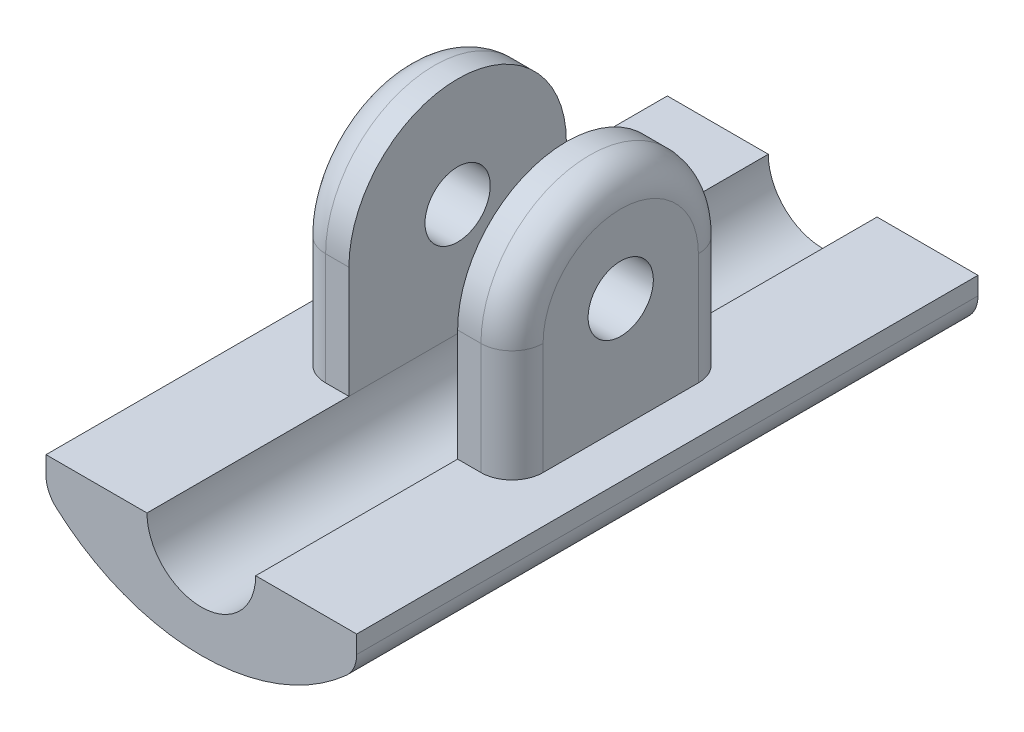
ISO-10303-21;
HEADER;
FILE_DESCRIPTION(('STEP AP214'),'2;1');
FILE_NAME('part.step','',(''),(''),'','','');
FILE_SCHEMA(('AUTOMOTIVE_DESIGN { 1 0 10303 214 1 1 1 1 }'));
ENDSEC;
DATA;
#1=APPLICATION_CONTEXT('core data for automotive mechanical design processes');
#2=APPLICATION_PROTOCOL_DEFINITION('international standard','automotive_design',2000,#1);
#3=PRODUCT_CONTEXT('',#1,'mechanical');
#4=PRODUCT('Part','Part','',(#3));
#5=PRODUCT_RELATED_PRODUCT_CATEGORY('part','',(#4));
#6=PRODUCT_DEFINITION_FORMATION('','',#4);
#7=PRODUCT_DEFINITION_CONTEXT('part definition',#1,'design');
#8=PRODUCT_DEFINITION('design','',#6,#7);
#9=PRODUCT_DEFINITION_SHAPE('','',#8);
#10=(LENGTH_UNIT() NAMED_UNIT(*) SI_UNIT(.MILLI.,.METRE.));
#11=(NAMED_UNIT(*) PLANE_ANGLE_UNIT() SI_UNIT($,.RADIAN.));
#12=(NAMED_UNIT(*) SI_UNIT($,.STERADIAN.) SOLID_ANGLE_UNIT());
#13=UNCERTAINTY_MEASURE_WITH_UNIT(LENGTH_MEASURE(1.E-05),#10,'distance_accuracy_value','');
#14=(GEOMETRIC_REPRESENTATION_CONTEXT(3) GLOBAL_UNCERTAINTY_ASSIGNED_CONTEXT((#13)) GLOBAL_UNIT_ASSIGNED_CONTEXT((#10,
#11,#12)) REPRESENTATION_CONTEXT('',''));
#15=CARTESIAN_POINT('',(0.,0.,0.));
#16=DIRECTION('',(0.,0.,1.));
#17=DIRECTION('',(1.,0.,0.));
#18=AXIS2_PLACEMENT_3D('',#15,#16,#17);
#19=CARTESIAN_POINT('',(0.,2.,-20.));
#20=DIRECTION('',(0.,-1.,0.));
#21=DIRECTION('',(1.,0.,0.));
#22=AXIS2_PLACEMENT_3D('',#19,#20,#21);
#23=PLANE('',#22);
#24=DIRECTION('',(1.,0.,0.));
#25=VECTOR('',#24,1.);
#26=CARTESIAN_POINT('',(0.,2.,-20.));
#27=LINE('',#26,#25);
#28=CARTESIAN_POINT('',(3.5,2.,-20.));
#29=VERTEX_POINT('',#28);
#30=CARTESIAN_POINT('',(10.,2.,-20.));
#31=VERTEX_POINT('',#30);
#32=EDGE_CURVE('E217',#29,#31,#27,.T.);
#33=ORIENTED_EDGE('',*,*,#32,.F.);
#34=DIRECTION('',(0.,0.,1.));
#35=VECTOR('',#34,1.);
#36=CARTESIAN_POINT('',(3.5,2.,-40.));
#37=LINE('',#36,#35);
#38=CARTESIAN_POINT('',(3.5,2.,-7.));
#39=VERTEX_POINT('',#38);
#40=EDGE_CURVE('E198',#29,#39,#37,.T.);
#41=ORIENTED_EDGE('',*,*,#40,.T.);
#42=DIRECTION('',(1.,0.,0.));
#43=VECTOR('',#42,1.);
#44=CARTESIAN_POINT('',(-7.,2.,-7.));
#45=LINE('',#44,#43);
#46=CARTESIAN_POINT('',(5.,2.,-7.));
#47=VERTEX_POINT('',#46);
#48=EDGE_CURVE('E321',#39,#47,#45,.T.);
#49=ORIENTED_EDGE('',*,*,#48,.T.);
#50=CARTESIAN_POINT('',(5.,2.,-5.));
#51=DIRECTION('',(0.,-1.,0.));
#52=DIRECTION('',(1.,0.,0.));
#53=AXIS2_PLACEMENT_3D('',#50,#51,#52);
#54=CIRCLE('',#53,2.);
#55=CARTESIAN_POINT('',(7.,2.,-5.));
#56=VERTEX_POINT('',#55);
#57=EDGE_CURVE('E47',#47,#56,#54,.T.);
#58=ORIENTED_EDGE('',*,*,#57,.T.);
#59=DIRECTION('',(0.,0.,-1.));
#60=VECTOR('',#59,1.);
#61=CARTESIAN_POINT('',(7.,2.,0.));
#62=LINE('',#61,#60);
#63=CARTESIAN_POINT('',(7.,2.,5.));
#64=VERTEX_POINT('',#63);
#65=EDGE_CURVE('E299',#64,#56,#62,.T.);
#66=ORIENTED_EDGE('',*,*,#65,.F.);
#67=CARTESIAN_POINT('',(5.,2.,5.));
#68=DIRECTION('',(0.,-1.,0.));
#69=DIRECTION('',(1.,0.,0.));
#70=AXIS2_PLACEMENT_3D('',#67,#68,#69);
#71=CIRCLE('',#70,2.);
#72=CARTESIAN_POINT('',(5.,2.00000000000001,7.));
#73=VERTEX_POINT('',#72);
#74=EDGE_CURVE('E11',#64,#73,#71,.T.);
#75=ORIENTED_EDGE('',*,*,#74,.T.);
#76=DIRECTION('',(1.,0.,0.));
#77=VECTOR('',#76,1.);
#78=CARTESIAN_POINT('',(-7.,2.00000000000001,7.));
#79=LINE('',#78,#77);
#80=CARTESIAN_POINT('',(3.5,2.00000000000001,7.));
#81=VERTEX_POINT('',#80);
#82=EDGE_CURVE('E195',#81,#73,#79,.T.);
#83=ORIENTED_EDGE('',*,*,#82,.F.);
#84=CARTESIAN_POINT('',(3.5,2.,20.));
#85=VERTEX_POINT('',#84);
#86=EDGE_CURVE('E180',#81,#85,#37,.T.);
#87=ORIENTED_EDGE('',*,*,#86,.T.);
#88=DIRECTION('',(1.,0.,0.));
#89=VECTOR('',#88,1.);
#90=CARTESIAN_POINT('',(0.,2.,20.));
#91=LINE('',#90,#89);
#92=CARTESIAN_POINT('',(10.,2.,20.));
#93=VERTEX_POINT('',#92);
#94=EDGE_CURVE('E193',#85,#93,#91,.T.);
#95=ORIENTED_EDGE('',*,*,#94,.T.);
#96=DIRECTION('',(0.,0.,1.));
#97=VECTOR('',#96,1.);
#98=CARTESIAN_POINT('',(10.,2.,-20.));
#99=LINE('',#98,#97);
#100=EDGE_CURVE('E223',#31,#93,#99,.T.);
#101=ORIENTED_EDGE('',*,*,#100,.F.);
#102=EDGE_LOOP('',(#33,#41,#49,#58,#66,#75,#83,#87,#95,#101));
#103=FACE_BOUND('',#102,.T.);
#104=ADVANCED_FACE('F38',(#103),#23,.F.);
#105=CARTESIAN_POINT('',(-7.,9.2,0.));
#106=DIRECTION('',(1.,0.,0.));
#107=DIRECTION('',(0.,0.,-1.));
#108=AXIS2_PLACEMENT_3D('',#105,#106,#107);
#109=CYLINDRICAL_SURFACE('',#108,7.);
#110=DIRECTION('',(1.,0.,0.));
#111=VECTOR('',#110,1.);
#112=CARTESIAN_POINT('',(-7.,9.2,-7.));
#113=LINE('',#112,#111);
#114=CARTESIAN_POINT('',(-5.,9.2,-7.));
#115=VERTEX_POINT('',#114);
#116=CARTESIAN_POINT('',(-3.5,9.2,-7.));
#117=VERTEX_POINT('',#116);
#118=EDGE_CURVE('E316',#115,#117,#113,.T.);
#119=ORIENTED_EDGE('',*,*,#118,.F.);
#120=CARTESIAN_POINT('',(-5.,9.2,0.));
#121=DIRECTION('',(1.,0.,0.));
#122=DIRECTION('',(0.,0.,-1.));
#123=AXIS2_PLACEMENT_3D('',#120,#121,#122);
#124=CIRCLE('',#123,7.);
#125=CARTESIAN_POINT('',(-5.,9.2,7.));
#126=VERTEX_POINT('',#125);
#127=EDGE_CURVE('E270',#115,#126,#124,.T.);
#128=ORIENTED_EDGE('',*,*,#127,.T.);
#129=DIRECTION('',(1.,0.,0.));
#130=VECTOR('',#129,1.);
#131=CARTESIAN_POINT('',(-7.,9.2,7.));
#132=LINE('',#131,#130);
#133=CARTESIAN_POINT('',(-3.5,9.2,7.));
#134=VERTEX_POINT('',#133);
#135=EDGE_CURVE('E324',#126,#134,#132,.T.);
#136=ORIENTED_EDGE('',*,*,#135,.T.);
#137=CARTESIAN_POINT('',(-3.5,9.2,0.));
#138=DIRECTION('',(-1.,0.,0.));
#139=DIRECTION('',(0.,0.,1.));
#140=AXIS2_PLACEMENT_3D('',#137,#138,#139);
#141=CIRCLE('',#140,7.);
#142=EDGE_CURVE('E309',#117,#134,#141,.F.);
#143=ORIENTED_EDGE('',*,*,#142,.F.);
#144=EDGE_LOOP('',(#119,#128,#136,#143));
#145=FACE_BOUND('',#144,.T.);
#146=ADVANCED_FACE('F372',(#145),#109,.T.);
#147=CARTESIAN_POINT('',(-7.,0.,-7.));
#148=DIRECTION('',(0.,0.,-1.));
#149=DIRECTION('',(0.,1.,0.));
#150=AXIS2_PLACEMENT_3D('',#147,#148,#149);
#151=PLANE('',#150);
#152=CARTESIAN_POINT('',(-5.,2.,-7.));
#153=VERTEX_POINT('',#152);
#154=CARTESIAN_POINT('',(-3.5,2.,-7.));
#155=VERTEX_POINT('',#154);
#156=EDGE_CURVE('E319',#153,#155,#45,.T.);
#157=ORIENTED_EDGE('',*,*,#156,.F.);
#158=DIRECTION('',(0.,1.,0.));
#159=VECTOR('',#158,1.);
#160=CARTESIAN_POINT('',(-5.,9.2,-7.));
#161=LINE('',#160,#159);
#162=EDGE_CURVE('E249',#153,#115,#161,.T.);
#163=ORIENTED_EDGE('',*,*,#162,.T.);
#164=ORIENTED_EDGE('',*,*,#118,.T.);
#165=DIRECTION('',(0.,1.,0.));
#166=VECTOR('',#165,1.);
#167=CARTESIAN_POINT('',(-3.5,0.,-7.));
#168=LINE('',#167,#166);
#169=EDGE_CURVE('E445',#155,#117,#168,.T.);
#170=ORIENTED_EDGE('',*,*,#169,.F.);
#171=EDGE_LOOP('',(#157,#163,#164,#170));
#172=FACE_BOUND('',#171,.T.);
#173=ADVANCED_FACE('F377',(#172),#151,.T.);
#174=CARTESIAN_POINT('',(-7.,9.2,0.));
#175=DIRECTION('',(1.,0.,0.));
#176=DIRECTION('',(0.,0.,-1.));
#177=AXIS2_PLACEMENT_3D('',#174,#175,#176);
#178=CYLINDRICAL_SURFACE('',#177,2.1);
#179=CARTESIAN_POINT('',(-3.5,9.2,0.));
#180=DIRECTION('',(-1.,0.,0.));
#181=DIRECTION('',(0.,0.,1.));
#182=AXIS2_PLACEMENT_3D('',#179,#180,#181);
#183=CIRCLE('',#182,2.1);
#184=CARTESIAN_POINT('',(-3.5,9.2,2.1));
#185=VERTEX_POINT('',#184);
#186=EDGE_CURVE('E442',#185,#185,#183,.F.);
#187=ORIENTED_EDGE('',*,*,#186,.T.);
#188=EDGE_LOOP('',(#187));
#189=FACE_BOUND('',#188,.T.);
#190=CARTESIAN_POINT('',(-7.,9.2,0.));
#191=DIRECTION('',(1.,0.,0.));
#192=DIRECTION('',(0.,0.,-1.));
#193=AXIS2_PLACEMENT_3D('',#190,#191,#192);
#194=CIRCLE('',#193,2.1);
#195=CARTESIAN_POINT('',(-7.,9.2,-2.1));
#196=VERTEX_POINT('',#195);
#197=EDGE_CURVE('E302',#196,#196,#194,.T.);
#198=ORIENTED_EDGE('',*,*,#197,.F.);
#199=EDGE_LOOP('',(#198));
#200=FACE_BOUND('',#199,.T.);
#201=ADVANCED_FACE('F403',(#189,#200),#178,.F.);
#202=CARTESIAN_POINT('',(-7.,0.,7.));
#203=DIRECTION('',(0.,0.,-1.));
#204=DIRECTION('',(-1.,0.,0.));
#205=AXIS2_PLACEMENT_3D('',#202,#203,#204);
#206=PLANE('',#205);
#207=ORIENTED_EDGE('',*,*,#135,.F.);
#208=DIRECTION('',(0.,1.,0.));
#209=VECTOR('',#208,1.);
#210=CARTESIAN_POINT('',(-5.,0.,7.));
#211=LINE('',#210,#209);
#212=CARTESIAN_POINT('',(-5.,2.00000000000001,7.));
#213=VERTEX_POINT('',#212);
#214=EDGE_CURVE('E258',#126,#213,#211,.F.);
#215=ORIENTED_EDGE('',*,*,#214,.T.);
#216=CARTESIAN_POINT('',(-3.5,2.,7.));
#217=VERTEX_POINT('',#216);
#218=EDGE_CURVE('E322',#213,#217,#79,.T.);
#219=ORIENTED_EDGE('',*,*,#218,.T.);
#220=DIRECTION('',(0.,1.,0.));
#221=VECTOR('',#220,1.);
#222=CARTESIAN_POINT('',(-3.5,0.,7.));
#223=LINE('',#222,#221);
#224=EDGE_CURVE('E227',#217,#134,#223,.T.);
#225=ORIENTED_EDGE('',*,*,#224,.T.);
#226=EDGE_LOOP('',(#207,#215,#219,#225));
#227=FACE_BOUND('',#226,.T.);
#228=ADVANCED_FACE('F391',(#227),#206,.F.);
#229=CARTESIAN_POINT('',(0.,9.79795897113272,-20.));
#230=DIRECTION('',(0.,0.,1.));
#231=DIRECTION('',(1.,0.,0.));
#232=AXIS2_PLACEMENT_3D('',#229,#230,#231);
#233=CYLINDRICAL_SURFACE('',#232,14.);
#234=CARTESIAN_POINT('',(0.,9.79795897113272,20.));
#235=DIRECTION('',(0.,0.,1.));
#236=DIRECTION('',(1.,0.,0.));
#237=AXIS2_PLACEMENT_3D('',#234,#235,#236);
#238=CIRCLE('',#237,14.);
#239=CARTESIAN_POINT('',(9.33333333333333,-0.637024923866303,20.));
#240=VERTEX_POINT('',#239);
#241=CARTESIAN_POINT('',(-9.33333333333333,-0.637024923866306,20.));
#242=VERTEX_POINT('',#241);
#243=EDGE_CURVE('E206',#240,#242,#238,.F.);
#244=ORIENTED_EDGE('',*,*,#243,.T.);
#245=DIRECTION('',(0.,0.,1.));
#246=VECTOR('',#245,1.);
#247=CARTESIAN_POINT('',(-9.33333333333333,-0.637024923866306,-20.));
#248=LINE('',#247,#246);
#249=CARTESIAN_POINT('',(-9.33333333333333,-0.637024923866306,-20.));
#250=VERTEX_POINT('',#249);
#251=EDGE_CURVE('E241',#242,#250,#248,.F.);
#252=ORIENTED_EDGE('',*,*,#251,.T.);
#253=CARTESIAN_POINT('',(0.,9.79795897113272,-20.));
#254=DIRECTION('',(0.,0.,1.));
#255=DIRECTION('',(1.,0.,0.));
#256=AXIS2_PLACEMENT_3D('',#253,#254,#255);
#257=CIRCLE('',#256,14.);
#258=CARTESIAN_POINT('',(9.33333333333333,-0.637024923866303,-20.));
#259=VERTEX_POINT('',#258);
#260=EDGE_CURVE('E211',#259,#250,#257,.F.);
#261=ORIENTED_EDGE('',*,*,#260,.F.);
#262=DIRECTION('',(0.,0.,1.));
#263=VECTOR('',#262,1.);
#264=CARTESIAN_POINT('',(9.33333333333333,-0.637024923866305,-20.));
#265=LINE('',#264,#263);
#266=EDGE_CURVE('E238',#259,#240,#265,.T.);
#267=ORIENTED_EDGE('',*,*,#266,.T.);
#268=EDGE_LOOP('',(#244,#252,#261,#267));
#269=FACE_BOUND('',#268,.T.);
#270=ADVANCED_FACE('F329',(#269),#233,.T.);
#271=CARTESIAN_POINT('',(-10.,0.,-20.));
#272=DIRECTION('',(1.,0.,0.));
#273=DIRECTION('',(0.,0.,-1.));
#274=AXIS2_PLACEMENT_3D('',#271,#272,#273);
#275=PLANE('',#274);
#276=DIRECTION('',(0.,1.,0.));
#277=VECTOR('',#276,1.);
#278=CARTESIAN_POINT('',(-10.,0.,-20.));
#279=LINE('',#278,#277);
#280=CARTESIAN_POINT('',(-10.,0.853687061133554,-20.));
#281=VERTEX_POINT('',#280);
#282=CARTESIAN_POINT('',(-10.,2.,-20.));
#283=VERTEX_POINT('',#282);
#284=EDGE_CURVE('E221',#281,#283,#279,.T.);
#285=ORIENTED_EDGE('',*,*,#284,.F.);
#286=DIRECTION('',(0.,0.,1.));
#287=VECTOR('',#286,1.);
#288=CARTESIAN_POINT('',(-10.,0.853687061133554,-20.));
#289=LINE('',#288,#287);
#290=CARTESIAN_POINT('',(-10.,0.853687061133554,20.));
#291=VERTEX_POINT('',#290);
#292=EDGE_CURVE('E231',#281,#291,#289,.T.);
#293=ORIENTED_EDGE('',*,*,#292,.T.);
#294=DIRECTION('',(0.,1.,0.));
#295=VECTOR('',#294,1.);
#296=CARTESIAN_POINT('',(-10.,0.,20.));
#297=LINE('',#296,#295);
#298=CARTESIAN_POINT('',(-10.,2.,20.));
#299=VERTEX_POINT('',#298);
#300=EDGE_CURVE('E205',#291,#299,#297,.T.);
#301=ORIENTED_EDGE('',*,*,#300,.T.);
#302=DIRECTION('',(0.,0.,1.));
#303=VECTOR('',#302,1.);
#304=CARTESIAN_POINT('',(-10.,2.,-20.));
#305=LINE('',#304,#303);
#306=EDGE_CURVE('E224',#283,#299,#305,.T.);
#307=ORIENTED_EDGE('',*,*,#306,.F.);
#308=EDGE_LOOP('',(#285,#293,#301,#307));
#309=FACE_BOUND('',#308,.T.);
#310=ADVANCED_FACE('F341',(#309),#275,.F.);
#311=CARTESIAN_POINT('',(-3.5,2.,20.));
#312=VERTEX_POINT('',#311);
#313=EDGE_CURVE('E203',#299,#312,#91,.T.);
#314=ORIENTED_EDGE('',*,*,#313,.T.);
#315=DIRECTION('',(0.,0.,1.));
#316=VECTOR('',#315,1.);
#317=CARTESIAN_POINT('',(-3.5,2.,-40.));
#318=LINE('',#317,#316);
#319=EDGE_CURVE('E184',#312,#217,#318,.F.);
#320=ORIENTED_EDGE('',*,*,#319,.T.);
#321=ORIENTED_EDGE('',*,*,#218,.F.);
#322=CARTESIAN_POINT('',(-5.,2.,5.));
#323=DIRECTION('',(0.,-1.,0.));
#324=DIRECTION('',(1.,0.,0.));
#325=AXIS2_PLACEMENT_3D('',#322,#323,#324);
#326=CIRCLE('',#325,2.);
#327=CARTESIAN_POINT('',(-7.,2.,5.));
#328=VERTEX_POINT('',#327);
#329=EDGE_CURVE('E276',#213,#328,#326,.T.);
#330=ORIENTED_EDGE('',*,*,#329,.T.);
#331=DIRECTION('',(0.,0.,-1.));
#332=VECTOR('',#331,1.);
#333=CARTESIAN_POINT('',(-7.,2.,0.));
#334=LINE('',#333,#332);
#335=CARTESIAN_POINT('',(-7.,2.,-5.));
#336=VERTEX_POINT('',#335);
#337=EDGE_CURVE('E306',#328,#336,#334,.T.);
#338=ORIENTED_EDGE('',*,*,#337,.T.);
#339=CARTESIAN_POINT('',(-5.,2.,-5.));
#340=DIRECTION('',(0.,-1.,0.));
#341=DIRECTION('',(1.,0.,0.));
#342=AXIS2_PLACEMENT_3D('',#339,#340,#341);
#343=CIRCLE('',#342,2.);
#344=EDGE_CURVE('E274',#336,#153,#343,.T.);
#345=ORIENTED_EDGE('',*,*,#344,.T.);
#346=ORIENTED_EDGE('',*,*,#156,.T.);
#347=CARTESIAN_POINT('',(-3.5,2.,-20.));
#348=VERTEX_POINT('',#347);
#349=EDGE_CURVE('E196',#155,#348,#318,.F.);
#350=ORIENTED_EDGE('',*,*,#349,.T.);
#351=EDGE_CURVE('E218',#283,#348,#27,.T.);
#352=ORIENTED_EDGE('',*,*,#351,.F.);
#353=ORIENTED_EDGE('',*,*,#306,.T.);
#354=EDGE_LOOP('',(#314,#320,#321,#330,#338,#345,#346,#350,#352,#353));
#355=FACE_BOUND('',#354,.T.);
#356=ADVANCED_FACE('F346',(#355),#23,.F.);
#357=CARTESIAN_POINT('',(10.,0.,-20.));
#358=DIRECTION('',(1.,0.,0.));
#359=DIRECTION('',(0.,0.,-1.));
#360=AXIS2_PLACEMENT_3D('',#357,#358,#359);
#361=PLANE('',#360);
#362=DIRECTION('',(0.,1.,0.));
#363=VECTOR('',#362,1.);
#364=CARTESIAN_POINT('',(10.,0.,20.));
#365=LINE('',#364,#363);
#366=CARTESIAN_POINT('',(10.,0.853687061133557,20.));
#367=VERTEX_POINT('',#366);
#368=EDGE_CURVE('E201',#367,#93,#365,.T.);
#369=ORIENTED_EDGE('',*,*,#368,.F.);
#370=DIRECTION('',(0.,0.,-1.));
#371=VECTOR('',#370,1.);
#372=CARTESIAN_POINT('',(10.,0.853687061133557,-20.));
#373=LINE('',#372,#371);
#374=CARTESIAN_POINT('',(10.,0.853687061133557,-20.));
#375=VERTEX_POINT('',#374);
#376=EDGE_CURVE('E247',#367,#375,#373,.T.);
#377=ORIENTED_EDGE('',*,*,#376,.T.);
#378=DIRECTION('',(0.,1.,0.));
#379=VECTOR('',#378,1.);
#380=CARTESIAN_POINT('',(10.,0.,-20.));
#381=LINE('',#380,#379);
#382=EDGE_CURVE('E214',#375,#31,#381,.T.);
#383=ORIENTED_EDGE('',*,*,#382,.T.);
#384=ORIENTED_EDGE('',*,*,#100,.T.);
#385=EDGE_LOOP('',(#369,#377,#383,#384));
#386=FACE_BOUND('',#385,.T.);
#387=ADVANCED_FACE('F355',(#386),#361,.T.);
#388=CARTESIAN_POINT('',(0.,0.,-20.));
#389=DIRECTION('',(0.,0.,1.));
#390=DIRECTION('',(1.,0.,0.));
#391=AXIS2_PLACEMENT_3D('',#388,#389,#390);
#392=PLANE('',#391);
#393=ORIENTED_EDGE('',*,*,#351,.T.);
#394=CARTESIAN_POINT('',(0.,2.,-20.));
#395=DIRECTION('',(0.,0.,1.));
#396=DIRECTION('',(1.,0.,0.));
#397=AXIS2_PLACEMENT_3D('',#394,#395,#396);
#398=CIRCLE('',#397,3.5);
#399=EDGE_CURVE('E349',#348,#29,#398,.T.);
#400=ORIENTED_EDGE('',*,*,#399,.T.);
#401=ORIENTED_EDGE('',*,*,#32,.T.);
#402=ORIENTED_EDGE('',*,*,#382,.F.);
#403=CARTESIAN_POINT('',(8.,0.853687061133557,-20.));
#404=DIRECTION('',(0.,0.,1.));
#405=DIRECTION('',(1.,0.,0.));
#406=AXIS2_PLACEMENT_3D('',#403,#404,#405);
#407=CIRCLE('',#406,2.);
#408=EDGE_CURVE('E243',#375,#259,#407,.F.);
#409=ORIENTED_EDGE('',*,*,#408,.T.);
#410=ORIENTED_EDGE('',*,*,#260,.T.);
#411=CARTESIAN_POINT('',(-8.,0.853687061133554,-20.));
#412=DIRECTION('',(0.,0.,1.));
#413=DIRECTION('',(1.,0.,0.));
#414=AXIS2_PLACEMENT_3D('',#411,#412,#413);
#415=CIRCLE('',#414,2.);
#416=EDGE_CURVE('E245',#250,#281,#415,.F.);
#417=ORIENTED_EDGE('',*,*,#416,.T.);
#418=ORIENTED_EDGE('',*,*,#284,.T.);
#419=EDGE_LOOP('',(#393,#400,#401,#402,#409,#410,#417,#418));
#420=FACE_BOUND('',#419,.T.);
#421=ADVANCED_FACE('F338',(#420),#392,.F.);
#422=CARTESIAN_POINT('',(0.,0.,20.));
#423=DIRECTION('',(0.,0.,1.));
#424=DIRECTION('',(1.,0.,0.));
#425=AXIS2_PLACEMENT_3D('',#422,#423,#424);
#426=PLANE('',#425);
#427=CARTESIAN_POINT('',(0.,2.,20.));
#428=DIRECTION('',(0.,0.,1.));
#429=DIRECTION('',(1.,0.,0.));
#430=AXIS2_PLACEMENT_3D('',#427,#428,#429);
#431=CIRCLE('',#430,3.5);
#432=EDGE_CURVE('E177',#312,#85,#431,.T.);
#433=ORIENTED_EDGE('',*,*,#432,.F.);
#434=ORIENTED_EDGE('',*,*,#313,.F.);
#435=ORIENTED_EDGE('',*,*,#300,.F.);
#436=CARTESIAN_POINT('',(-8.,0.853687061133554,20.));
#437=DIRECTION('',(0.,0.,1.));
#438=DIRECTION('',(1.,0.,0.));
#439=AXIS2_PLACEMENT_3D('',#436,#437,#438);
#440=CIRCLE('',#439,2.);
#441=EDGE_CURVE('E236',#291,#242,#440,.T.);
#442=ORIENTED_EDGE('',*,*,#441,.T.);
#443=ORIENTED_EDGE('',*,*,#243,.F.);
#444=CARTESIAN_POINT('',(8.,0.853687061133557,20.));
#445=DIRECTION('',(0.,0.,1.));
#446=DIRECTION('',(1.,0.,0.));
#447=AXIS2_PLACEMENT_3D('',#444,#445,#446);
#448=CIRCLE('',#447,2.);
#449=EDGE_CURVE('E234',#240,#367,#448,.T.);
#450=ORIENTED_EDGE('',*,*,#449,.T.);
#451=ORIENTED_EDGE('',*,*,#368,.T.);
#452=ORIENTED_EDGE('',*,*,#94,.F.);
#453=EDGE_LOOP('',(#433,#434,#435,#442,#443,#450,#451,#452));
#454=FACE_BOUND('',#453,.T.);
#455=ADVANCED_FACE('F199',(#454),#426,.T.);
#456=CARTESIAN_POINT('',(3.5,9.2,7.));
#457=VERTEX_POINT('',#456);
#458=CARTESIAN_POINT('',(5.,9.2,7.));
#459=VERTEX_POINT('',#458);
#460=EDGE_CURVE('E315',#457,#459,#132,.T.);
#461=ORIENTED_EDGE('',*,*,#460,.T.);
#462=CARTESIAN_POINT('',(5.,9.2,0.));
#463=DIRECTION('',(1.,0.,0.));
#464=DIRECTION('',(0.,0.,-1.));
#465=AXIS2_PLACEMENT_3D('',#462,#463,#464);
#466=CIRCLE('',#465,7.);
#467=CARTESIAN_POINT('',(5.,9.2,-7.));
#468=VERTEX_POINT('',#467);
#469=EDGE_CURVE('E272',#459,#468,#466,.F.);
#470=ORIENTED_EDGE('',*,*,#469,.T.);
#471=CARTESIAN_POINT('',(3.5,9.2,-7.));
#472=VERTEX_POINT('',#471);
#473=EDGE_CURVE('E318',#472,#468,#113,.T.);
#474=ORIENTED_EDGE('',*,*,#473,.F.);
#475=CARTESIAN_POINT('',(3.5,9.2,0.));
#476=DIRECTION('',(1.,0.,0.));
#477=DIRECTION('',(0.,1.,0.));
#478=AXIS2_PLACEMENT_3D('',#475,#476,#477);
#479=CIRCLE('',#478,7.);
#480=EDGE_CURVE('E428',#457,#472,#479,.F.);
#481=ORIENTED_EDGE('',*,*,#480,.F.);
#482=EDGE_LOOP('',(#461,#470,#474,#481));
#483=FACE_BOUND('',#482,.T.);
#484=ADVANCED_FACE('F380',(#483),#109,.T.);
#485=ORIENTED_EDGE('',*,*,#473,.T.);
#486=DIRECTION('',(0.,1.,0.));
#487=VECTOR('',#486,1.);
#488=CARTESIAN_POINT('',(5.,0.,-7.));
#489=LINE('',#488,#487);
#490=EDGE_CURVE('E267',#468,#47,#489,.F.);
#491=ORIENTED_EDGE('',*,*,#490,.T.);
#492=ORIENTED_EDGE('',*,*,#48,.F.);
#493=DIRECTION('',(0.,-1.,0.));
#494=VECTOR('',#493,1.);
#495=CARTESIAN_POINT('',(3.5,0.,-7.));
#496=LINE('',#495,#494);
#497=EDGE_CURVE('E433',#472,#39,#496,.T.);
#498=ORIENTED_EDGE('',*,*,#497,.F.);
#499=EDGE_LOOP('',(#485,#491,#492,#498));
#500=FACE_BOUND('',#499,.T.);
#501=ADVANCED_FACE('F401',(#500),#151,.T.);
#502=CARTESIAN_POINT('',(3.5,9.2,0.));
#503=DIRECTION('',(1.,0.,0.));
#504=DIRECTION('',(0.,1.,0.));
#505=AXIS2_PLACEMENT_3D('',#502,#503,#504);
#506=CIRCLE('',#505,2.1);
#507=CARTESIAN_POINT('',(3.5,11.3,0.));
#508=VERTEX_POINT('',#507);
#509=EDGE_CURVE('E432',#508,#508,#506,.F.);
#510=ORIENTED_EDGE('',*,*,#509,.T.);
#511=EDGE_LOOP('',(#510));
#512=FACE_BOUND('',#511,.T.);
#513=CARTESIAN_POINT('',(7.,9.2,0.));
#514=DIRECTION('',(1.,0.,0.));
#515=DIRECTION('',(0.,0.,-1.));
#516=AXIS2_PLACEMENT_3D('',#513,#514,#515);
#517=CIRCLE('',#516,2.1);
#518=CARTESIAN_POINT('',(7.,9.2,-2.1));
#519=VERTEX_POINT('',#518);
#520=EDGE_CURVE('E303',#519,#519,#517,.T.);
#521=ORIENTED_EDGE('',*,*,#520,.T.);
#522=EDGE_LOOP('',(#521));
#523=FACE_BOUND('',#522,.T.);
#524=ADVANCED_FACE('F398',(#512,#523),#178,.F.);
#525=ORIENTED_EDGE('',*,*,#82,.T.);
#526=DIRECTION('',(0.,1.,0.));
#527=VECTOR('',#526,1.);
#528=CARTESIAN_POINT('',(5.,9.2,7.));
#529=LINE('',#528,#527);
#530=EDGE_CURVE('E60',#73,#459,#529,.T.);
#531=ORIENTED_EDGE('',*,*,#530,.T.);
#532=ORIENTED_EDGE('',*,*,#460,.F.);
#533=DIRECTION('',(0.,1.,0.));
#534=VECTOR('',#533,1.);
#535=CARTESIAN_POINT('',(3.5,2.00000000000001,7.));
#536=LINE('',#535,#534);
#537=EDGE_CURVE('E459',#81,#457,#536,.T.);
#538=ORIENTED_EDGE('',*,*,#537,.F.);
#539=EDGE_LOOP('',(#525,#531,#532,#538));
#540=FACE_BOUND('',#539,.T.);
#541=ADVANCED_FACE('F400',(#540),#206,.F.);
#542=CARTESIAN_POINT('',(-7.,0.,0.));
#543=DIRECTION('',(1.,0.,0.));
#544=DIRECTION('',(0.,0.,-1.));
#545=AXIS2_PLACEMENT_3D('',#542,#543,#544);
#546=PLANE('',#545);
#547=ORIENTED_EDGE('',*,*,#197,.T.);
#548=EDGE_LOOP('',(#547));
#549=FACE_BOUND('',#548,.T.);
#550=CARTESIAN_POINT('',(-7.,9.2,0.));
#551=DIRECTION('',(1.,0.,0.));
#552=DIRECTION('',(0.,0.,-1.));
#553=AXIS2_PLACEMENT_3D('',#550,#551,#552);
#554=CIRCLE('',#553,5.);
#555=CARTESIAN_POINT('',(-7.,9.2,5.));
#556=VERTEX_POINT('',#555);
#557=CARTESIAN_POINT('',(-7.,9.2,-5.));
#558=VERTEX_POINT('',#557);
#559=EDGE_CURVE('E252',#556,#558,#554,.F.);
#560=ORIENTED_EDGE('',*,*,#559,.T.);
#561=DIRECTION('',(0.,1.,0.));
#562=VECTOR('',#561,1.);
#563=CARTESIAN_POINT('',(-7.,2.,-5.));
#564=LINE('',#563,#562);
#565=EDGE_CURVE('E256',#558,#336,#564,.F.);
#566=ORIENTED_EDGE('',*,*,#565,.T.);
#567=ORIENTED_EDGE('',*,*,#337,.F.);
#568=DIRECTION('',(0.,1.,0.));
#569=VECTOR('',#568,1.);
#570=CARTESIAN_POINT('',(-7.,0.,5.));
#571=LINE('',#570,#569);
#572=EDGE_CURVE('E254',#328,#556,#571,.T.);
#573=ORIENTED_EDGE('',*,*,#572,.T.);
#574=EDGE_LOOP('',(#560,#566,#567,#573));
#575=FACE_BOUND('',#574,.T.);
#576=ADVANCED_FACE('F409',(#549,#575),#546,.F.);
#577=CARTESIAN_POINT('',(7.,0.,0.));
#578=DIRECTION('',(1.,0.,0.));
#579=DIRECTION('',(0.,0.,-1.));
#580=AXIS2_PLACEMENT_3D('',#577,#578,#579);
#581=PLANE('',#580);
#582=ORIENTED_EDGE('',*,*,#65,.T.);
#583=DIRECTION('',(0.,1.,0.));
#584=VECTOR('',#583,1.);
#585=CARTESIAN_POINT('',(7.,0.,-5.));
#586=LINE('',#585,#584);
#587=CARTESIAN_POINT('',(7.,9.2,-5.));
#588=VERTEX_POINT('',#587);
#589=EDGE_CURVE('E264',#56,#588,#586,.T.);
#590=ORIENTED_EDGE('',*,*,#589,.T.);
#591=CARTESIAN_POINT('',(7.,9.2,0.));
#592=DIRECTION('',(1.,0.,0.));
#593=DIRECTION('',(0.,0.,-1.));
#594=AXIS2_PLACEMENT_3D('',#591,#592,#593);
#595=CIRCLE('',#594,5.);
#596=CARTESIAN_POINT('',(7.,9.2,5.));
#597=VERTEX_POINT('',#596);
#598=EDGE_CURVE('E260',#588,#597,#595,.T.);
#599=ORIENTED_EDGE('',*,*,#598,.T.);
#600=DIRECTION('',(0.,1.,0.));
#601=VECTOR('',#600,1.);
#602=CARTESIAN_POINT('',(7.,2.00000000000001,5.));
#603=LINE('',#602,#601);
#604=EDGE_CURVE('E262',#597,#64,#603,.F.);
#605=ORIENTED_EDGE('',*,*,#604,.T.);
#606=EDGE_LOOP('',(#582,#590,#599,#605));
#607=FACE_BOUND('',#606,.T.);
#608=ORIENTED_EDGE('',*,*,#520,.F.);
#609=EDGE_LOOP('',(#608));
#610=FACE_BOUND('',#609,.T.);
#611=ADVANCED_FACE('F297',(#607,#610),#581,.T.);
#612=CARTESIAN_POINT('',(-3.5,2.00000000000001,-53.));
#613=DIRECTION('',(-1.,0.,0.));
#614=DIRECTION('',(0.,0.,1.));
#615=AXIS2_PLACEMENT_3D('',#612,#613,#614);
#616=PLANE('',#615);
#617=ORIENTED_EDGE('',*,*,#142,.T.);
#618=ORIENTED_EDGE('',*,*,#224,.F.);
#619=DIRECTION('',(0.,0.,1.));
#620=VECTOR('',#619,1.);
#621=CARTESIAN_POINT('',(-3.5,2.00000000000001,-53.));
#622=LINE('',#621,#620);
#623=EDGE_CURVE('E437',#155,#217,#622,.T.);
#624=ORIENTED_EDGE('',*,*,#623,.F.);
#625=ORIENTED_EDGE('',*,*,#169,.T.);
#626=EDGE_LOOP('',(#617,#618,#624,#625));
#627=FACE_BOUND('',#626,.T.);
#628=ORIENTED_EDGE('',*,*,#186,.F.);
#629=EDGE_LOOP('',(#628));
#630=FACE_BOUND('',#629,.T.);
#631=ADVANCED_FACE('F418',(#627,#630),#616,.F.);
#632=CARTESIAN_POINT('',(3.5,2.00000000000001,-53.));
#633=DIRECTION('',(1.,0.,0.));
#634=DIRECTION('',(0.,1.,0.));
#635=AXIS2_PLACEMENT_3D('',#632,#633,#634);
#636=PLANE('',#635);
#637=ORIENTED_EDGE('',*,*,#480,.T.);
#638=ORIENTED_EDGE('',*,*,#497,.T.);
#639=DIRECTION('',(0.,0.,1.));
#640=VECTOR('',#639,1.);
#641=CARTESIAN_POINT('',(3.5,2.00000000000001,-53.));
#642=LINE('',#641,#640);
#643=EDGE_CURVE('E434',#39,#81,#642,.T.);
#644=ORIENTED_EDGE('',*,*,#643,.T.);
#645=ORIENTED_EDGE('',*,*,#537,.T.);
#646=EDGE_LOOP('',(#637,#638,#644,#645));
#647=FACE_BOUND('',#646,.T.);
#648=ORIENTED_EDGE('',*,*,#509,.F.);
#649=EDGE_LOOP('',(#648));
#650=FACE_BOUND('',#649,.T.);
#651=ADVANCED_FACE('F368',(#647,#650),#636,.F.);
#652=CARTESIAN_POINT('',(-8.,0.853687061133554,-20.));
#653=DIRECTION('',(0.,0.,1.));
#654=DIRECTION('',(1.,0.,0.));
#655=AXIS2_PLACEMENT_3D('',#652,#653,#654);
#656=CYLINDRICAL_SURFACE('',#655,2.);
#657=ORIENTED_EDGE('',*,*,#416,.F.);
#658=ORIENTED_EDGE('',*,*,#251,.F.);
#659=ORIENTED_EDGE('',*,*,#441,.F.);
#660=ORIENTED_EDGE('',*,*,#292,.F.);
#661=EDGE_LOOP('',(#657,#658,#659,#660));
#662=FACE_BOUND('',#661,.T.);
#663=ADVANCED_FACE('F334',(#662),#656,.T.);
#664=CARTESIAN_POINT('',(8.,0.853687061133557,-20.));
#665=DIRECTION('',(0.,0.,1.));
#666=DIRECTION('',(1.,0.,0.));
#667=AXIS2_PLACEMENT_3D('',#664,#665,#666);
#668=CYLINDRICAL_SURFACE('',#667,2.);
#669=ORIENTED_EDGE('',*,*,#408,.F.);
#670=ORIENTED_EDGE('',*,*,#376,.F.);
#671=ORIENTED_EDGE('',*,*,#449,.F.);
#672=ORIENTED_EDGE('',*,*,#266,.F.);
#673=EDGE_LOOP('',(#669,#670,#671,#672));
#674=FACE_BOUND('',#673,.T.);
#675=ADVANCED_FACE('F359',(#674),#668,.T.);
#676=CARTESIAN_POINT('',(0.,2.,-40.));
#677=DIRECTION('',(0.,0.,1.));
#678=DIRECTION('',(1.,0.,0.));
#679=AXIS2_PLACEMENT_3D('',#676,#677,#678);
#680=CYLINDRICAL_SURFACE('',#679,3.5);
#681=ORIENTED_EDGE('',*,*,#432,.T.);
#682=ORIENTED_EDGE('',*,*,#86,.F.);
#683=ORIENTED_EDGE('',*,*,#643,.F.);
#684=ORIENTED_EDGE('',*,*,#40,.F.);
#685=ORIENTED_EDGE('',*,*,#399,.F.);
#686=ORIENTED_EDGE('',*,*,#349,.F.);
#687=ORIENTED_EDGE('',*,*,#623,.T.);
#688=ORIENTED_EDGE('',*,*,#319,.F.);
#689=EDGE_LOOP('',(#681,#682,#683,#684,#685,#686,#687,#688));
#690=FACE_BOUND('',#689,.T.);
#691=ADVANCED_FACE('F179',(#690),#680,.F.);
#692=CARTESIAN_POINT('',(-5.,0.,5.));
#693=DIRECTION('',(0.,1.,0.));
#694=DIRECTION('',(0.,0.,1.));
#695=AXIS2_PLACEMENT_3D('',#692,#693,#694);
#696=CYLINDRICAL_SURFACE('',#695,2.);
#697=ORIENTED_EDGE('',*,*,#329,.F.);
#698=ORIENTED_EDGE('',*,*,#214,.F.);
#699=CARTESIAN_POINT('',(-5.,9.2,5.));
#700=DIRECTION('',(0.,1.,0.));
#701=DIRECTION('',(0.,0.,1.));
#702=AXIS2_PLACEMENT_3D('',#699,#700,#701);
#703=CIRCLE('',#702,2.);
#704=EDGE_CURVE('E189',#556,#126,#703,.T.);
#705=ORIENTED_EDGE('',*,*,#704,.F.);
#706=ORIENTED_EDGE('',*,*,#572,.F.);
#707=EDGE_LOOP('',(#697,#698,#705,#706));
#708=FACE_BOUND('',#707,.T.);
#709=ADVANCED_FACE('F366',(#708),#696,.T.);
#710=CARTESIAN_POINT('',(-5.,9.2,0.));
#711=DIRECTION('',(1.,0.,0.));
#712=DIRECTION('',(0.,0.,-1.));
#713=AXIS2_PLACEMENT_3D('',#710,#711,#712);
#714=TOROIDAL_SURFACE('',#713,5.,2.);
#715=ORIENTED_EDGE('',*,*,#704,.T.);
#716=ORIENTED_EDGE('',*,*,#127,.F.);
#717=CARTESIAN_POINT('',(-5.,9.2,-5.));
#718=DIRECTION('',(0.,-1.,0.));
#719=DIRECTION('',(0.,0.,-1.));
#720=AXIS2_PLACEMENT_3D('',#717,#718,#719);
#721=CIRCLE('',#720,2.);
#722=EDGE_CURVE('E279',#558,#115,#721,.T.);
#723=ORIENTED_EDGE('',*,*,#722,.F.);
#724=ORIENTED_EDGE('',*,*,#559,.F.);
#725=EDGE_LOOP('',(#715,#716,#723,#724));
#726=FACE_BOUND('',#725,.T.);
#727=ADVANCED_FACE('F475',(#726),#714,.T.);
#728=CARTESIAN_POINT('',(-5.,0.,-5.));
#729=DIRECTION('',(0.,-1.,0.));
#730=DIRECTION('',(0.,0.,-1.));
#731=AXIS2_PLACEMENT_3D('',#728,#729,#730);
#732=CYLINDRICAL_SURFACE('',#731,2.);
#733=ORIENTED_EDGE('',*,*,#344,.F.);
#734=ORIENTED_EDGE('',*,*,#565,.F.);
#735=ORIENTED_EDGE('',*,*,#722,.T.);
#736=ORIENTED_EDGE('',*,*,#162,.F.);
#737=EDGE_LOOP('',(#733,#734,#735,#736));
#738=FACE_BOUND('',#737,.T.);
#739=ADVANCED_FACE('F478',(#738),#732,.T.);
#740=CARTESIAN_POINT('',(5.,0.,5.));
#741=DIRECTION('',(0.,-1.,0.));
#742=DIRECTION('',(0.,0.,-1.));
#743=AXIS2_PLACEMENT_3D('',#740,#741,#742);
#744=CYLINDRICAL_SURFACE('',#743,2.);
#745=ORIENTED_EDGE('',*,*,#74,.F.);
#746=ORIENTED_EDGE('',*,*,#604,.F.);
#747=CARTESIAN_POINT('',(5.,9.2,5.));
#748=DIRECTION('',(0.,1.,0.));
#749=DIRECTION('',(0.,0.,1.));
#750=AXIS2_PLACEMENT_3D('',#747,#748,#749);
#751=CIRCLE('',#750,2.);
#752=EDGE_CURVE('E42',#459,#597,#751,.T.);
#753=ORIENTED_EDGE('',*,*,#752,.F.);
#754=ORIENTED_EDGE('',*,*,#530,.F.);
#755=EDGE_LOOP('',(#745,#746,#753,#754));
#756=FACE_BOUND('',#755,.T.);
#757=ADVANCED_FACE('F40',(#756),#744,.T.);
#758=CARTESIAN_POINT('',(5.,9.2,0.));
#759=DIRECTION('',(1.,0.,0.));
#760=DIRECTION('',(0.,0.,-1.));
#761=AXIS2_PLACEMENT_3D('',#758,#759,#760);
#762=TOROIDAL_SURFACE('',#761,5.,2.);
#763=ORIENTED_EDGE('',*,*,#752,.T.);
#764=ORIENTED_EDGE('',*,*,#598,.F.);
#765=CARTESIAN_POINT('',(5.,9.2,-5.));
#766=DIRECTION('',(0.,-1.,0.));
#767=DIRECTION('',(0.,0.,-1.));
#768=AXIS2_PLACEMENT_3D('',#765,#766,#767);
#769=CIRCLE('',#768,2.);
#770=EDGE_CURVE('E282',#468,#588,#769,.T.);
#771=ORIENTED_EDGE('',*,*,#770,.F.);
#772=ORIENTED_EDGE('',*,*,#469,.F.);
#773=EDGE_LOOP('',(#763,#764,#771,#772));
#774=FACE_BOUND('',#773,.T.);
#775=ADVANCED_FACE('F292',(#774),#762,.T.);
#776=CARTESIAN_POINT('',(5.,0.,-5.));
#777=DIRECTION('',(0.,1.,0.));
#778=DIRECTION('',(0.,0.,1.));
#779=AXIS2_PLACEMENT_3D('',#776,#777,#778);
#780=CYLINDRICAL_SURFACE('',#779,2.);
#781=ORIENTED_EDGE('',*,*,#57,.F.);
#782=ORIENTED_EDGE('',*,*,#490,.F.);
#783=ORIENTED_EDGE('',*,*,#770,.T.);
#784=ORIENTED_EDGE('',*,*,#589,.F.);
#785=EDGE_LOOP('',(#781,#782,#783,#784));
#786=FACE_BOUND('',#785,.T.);
#787=ADVANCED_FACE('F466',(#786),#780,.T.);
#788=CLOSED_SHELL('',(#104,#146,#173,#201,#228,#270,#310,#356,#387,#421,#455,#484,#501,#524,
#541,#576,#611,#631,#651,#663,#675,#691,#709,#727,#739,#757,#775,#787));
#789=MANIFOLD_SOLID_BREP('B2',#788);
#790=ADVANCED_BREP_SHAPE_REPRESENTATION('',(#18,#789),#14);
#791=SHAPE_DEFINITION_REPRESENTATION(#9,#790);
ENDSEC;
END-ISO-10303-21;
